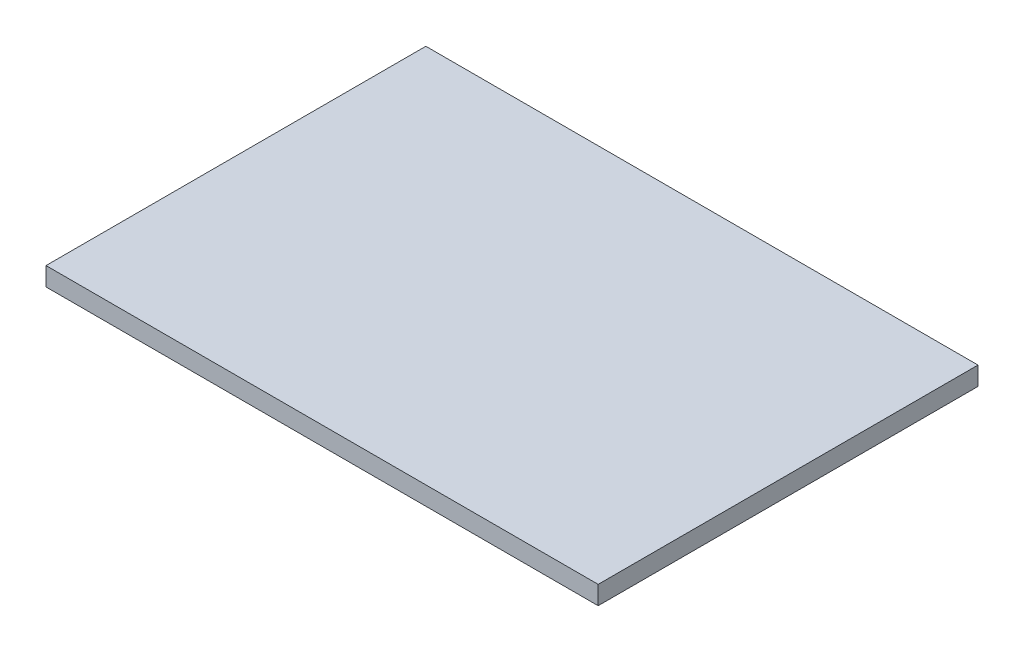
ISO-10303-21;
HEADER;
FILE_DESCRIPTION(('STEP AP214'),'2;1');
FILE_NAME('part.step','',(''),(''),'','','');
FILE_SCHEMA(('AUTOMOTIVE_DESIGN { 1 0 10303 214 1 1 1 1 }'));
ENDSEC;
DATA;
#1=APPLICATION_CONTEXT('core data for automotive mechanical design processes');
#2=APPLICATION_PROTOCOL_DEFINITION('international standard','automotive_design',2000,#1);
#3=PRODUCT_CONTEXT('',#1,'mechanical');
#4=PRODUCT('Part','Part','',(#3));
#5=PRODUCT_RELATED_PRODUCT_CATEGORY('part','',(#4));
#6=PRODUCT_DEFINITION_FORMATION('','',#4);
#7=PRODUCT_DEFINITION_CONTEXT('part definition',#1,'design');
#8=PRODUCT_DEFINITION('design','',#6,#7);
#9=PRODUCT_DEFINITION_SHAPE('','',#8);
#10=(LENGTH_UNIT() NAMED_UNIT(*) SI_UNIT(.MILLI.,.METRE.));
#11=(NAMED_UNIT(*) PLANE_ANGLE_UNIT() SI_UNIT($,.RADIAN.));
#12=(NAMED_UNIT(*) SI_UNIT($,.STERADIAN.) SOLID_ANGLE_UNIT());
#13=UNCERTAINTY_MEASURE_WITH_UNIT(LENGTH_MEASURE(1.E-05),#10,'distance_accuracy_value','');
#14=(GEOMETRIC_REPRESENTATION_CONTEXT(3) GLOBAL_UNCERTAINTY_ASSIGNED_CONTEXT((#13)) GLOBAL_UNIT_ASSIGNED_CONTEXT((#10,
#11,#12)) REPRESENTATION_CONTEXT('',''));
#15=CARTESIAN_POINT('',(0.,0.,0.));
#16=DIRECTION('',(0.,0.,1.));
#17=DIRECTION('',(1.,0.,0.));
#18=AXIS2_PLACEMENT_3D('',#15,#16,#17);
#19=CARTESIAN_POINT('',(298.,20.,-205.));
#20=DIRECTION('',(-1.,0.,0.));
#21=DIRECTION('',(0.,0.,1.));
#22=AXIS2_PLACEMENT_3D('',#19,#20,#21);
#23=PLANE('',#22);
#24=DIRECTION('',(0.,0.,-1.));
#25=VECTOR('',#24,1.);
#26=CARTESIAN_POINT('',(298.,0.,-205.));
#27=LINE('',#26,#25);
#28=CARTESIAN_POINT('',(298.,0.,205.));
#29=VERTEX_POINT('',#28);
#30=CARTESIAN_POINT('',(298.,0.,-205.));
#31=VERTEX_POINT('',#30);
#32=EDGE_CURVE('E98',#29,#31,#27,.T.);
#33=ORIENTED_EDGE('',*,*,#32,.T.);
#34=DIRECTION('',(0.,-1.,0.));
#35=VECTOR('',#34,1.);
#36=CARTESIAN_POINT('',(298.,20.,-205.));
#37=LINE('',#36,#35);
#38=CARTESIAN_POINT('',(298.,20.,-205.));
#39=VERTEX_POINT('',#38);
#40=EDGE_CURVE('E11',#39,#31,#37,.T.);
#41=ORIENTED_EDGE('',*,*,#40,.F.);
#42=DIRECTION('',(0.,0.,-1.));
#43=VECTOR('',#42,1.);
#44=CARTESIAN_POINT('',(298.,20.,-205.));
#45=LINE('',#44,#43);
#46=CARTESIAN_POINT('',(298.,20.,205.));
#47=VERTEX_POINT('',#46);
#48=EDGE_CURVE('E86',#47,#39,#45,.T.);
#49=ORIENTED_EDGE('',*,*,#48,.F.);
#50=DIRECTION('',(0.,-1.,0.));
#51=VECTOR('',#50,1.);
#52=CARTESIAN_POINT('',(298.,20.,205.));
#53=LINE('',#52,#51);
#54=EDGE_CURVE('E94',#47,#29,#53,.T.);
#55=ORIENTED_EDGE('',*,*,#54,.T.);
#56=EDGE_LOOP('',(#33,#41,#49,#55));
#57=FACE_BOUND('',#56,.T.);
#58=ADVANCED_FACE('F35',(#57),#23,.F.);
#59=CARTESIAN_POINT('',(-298.,20.,-205.));
#60=DIRECTION('',(0.,0.,1.));
#61=DIRECTION('',(1.,0.,0.));
#62=AXIS2_PLACEMENT_3D('',#59,#60,#61);
#63=PLANE('',#62);
#64=DIRECTION('',(-1.,0.,0.));
#65=VECTOR('',#64,1.);
#66=CARTESIAN_POINT('',(-298.,0.,-205.));
#67=LINE('',#66,#65);
#68=CARTESIAN_POINT('',(-298.,0.,-205.));
#69=VERTEX_POINT('',#68);
#70=EDGE_CURVE('E90',#31,#69,#67,.T.);
#71=ORIENTED_EDGE('',*,*,#70,.T.);
#72=DIRECTION('',(0.,-1.,0.));
#73=VECTOR('',#72,1.);
#74=CARTESIAN_POINT('',(-298.,20.,-205.));
#75=LINE('',#74,#73);
#76=CARTESIAN_POINT('',(-298.,20.,-205.));
#77=VERTEX_POINT('',#76);
#78=EDGE_CURVE('E43',#77,#69,#75,.T.);
#79=ORIENTED_EDGE('',*,*,#78,.F.);
#80=DIRECTION('',(-1.,0.,0.));
#81=VECTOR('',#80,1.);
#82=CARTESIAN_POINT('',(-298.,20.,-205.));
#83=LINE('',#82,#81);
#84=EDGE_CURVE('E81',#39,#77,#83,.T.);
#85=ORIENTED_EDGE('',*,*,#84,.F.);
#86=ORIENTED_EDGE('',*,*,#40,.T.);
#87=EDGE_LOOP('',(#71,#79,#85,#86));
#88=FACE_BOUND('',#87,.T.);
#89=ADVANCED_FACE('F89',(#88),#63,.F.);
#90=CARTESIAN_POINT('',(-298.,20.,-205.));
#91=DIRECTION('',(1.,0.,0.));
#92=DIRECTION('',(0.,0.,-1.));
#93=AXIS2_PLACEMENT_3D('',#90,#91,#92);
#94=PLANE('',#93);
#95=DIRECTION('',(0.,0.,1.));
#96=VECTOR('',#95,1.);
#97=CARTESIAN_POINT('',(-298.,0.,-205.));
#98=LINE('',#97,#96);
#99=CARTESIAN_POINT('',(-298.,0.,205.));
#100=VERTEX_POINT('',#99);
#101=EDGE_CURVE('E68',#69,#100,#98,.T.);
#102=ORIENTED_EDGE('',*,*,#101,.T.);
#103=DIRECTION('',(0.,-1.,0.));
#104=VECTOR('',#103,1.);
#105=CARTESIAN_POINT('',(-298.,20.,205.));
#106=LINE('',#105,#104);
#107=CARTESIAN_POINT('',(-298.,20.,205.));
#108=VERTEX_POINT('',#107);
#109=EDGE_CURVE('E91',#108,#100,#106,.T.);
#110=ORIENTED_EDGE('',*,*,#109,.F.);
#111=DIRECTION('',(0.,0.,1.));
#112=VECTOR('',#111,1.);
#113=CARTESIAN_POINT('',(-298.,20.,-205.));
#114=LINE('',#113,#112);
#115=EDGE_CURVE('E84',#77,#108,#114,.T.);
#116=ORIENTED_EDGE('',*,*,#115,.F.);
#117=ORIENTED_EDGE('',*,*,#78,.T.);
#118=EDGE_LOOP('',(#102,#110,#116,#117));
#119=FACE_BOUND('',#118,.T.);
#120=ADVANCED_FACE('F92',(#119),#94,.F.);
#121=CARTESIAN_POINT('',(-298.,20.,205.));
#122=DIRECTION('',(0.,0.,-1.));
#123=DIRECTION('',(-1.,0.,0.));
#124=AXIS2_PLACEMENT_3D('',#121,#122,#123);
#125=PLANE('',#124);
#126=DIRECTION('',(1.,0.,0.));
#127=VECTOR('',#126,1.);
#128=CARTESIAN_POINT('',(-298.,0.,205.));
#129=LINE('',#128,#127);
#130=EDGE_CURVE('E74',#100,#29,#129,.T.);
#131=ORIENTED_EDGE('',*,*,#130,.T.);
#132=ORIENTED_EDGE('',*,*,#54,.F.);
#133=DIRECTION('',(1.,0.,0.));
#134=VECTOR('',#133,1.);
#135=CARTESIAN_POINT('',(-298.,20.,205.));
#136=LINE('',#135,#134);
#137=EDGE_CURVE('E51',#108,#47,#136,.T.);
#138=ORIENTED_EDGE('',*,*,#137,.F.);
#139=ORIENTED_EDGE('',*,*,#109,.T.);
#140=EDGE_LOOP('',(#131,#132,#138,#139));
#141=FACE_BOUND('',#140,.T.);
#142=ADVANCED_FACE('F105',(#141),#125,.F.);
#143=CARTESIAN_POINT('',(0.,20.,0.));
#144=DIRECTION('',(0.,1.,0.));
#145=DIRECTION('',(0.,0.,1.));
#146=AXIS2_PLACEMENT_3D('',#143,#144,#145);
#147=PLANE('',#146);
#148=ORIENTED_EDGE('',*,*,#48,.T.);
#149=ORIENTED_EDGE('',*,*,#84,.T.);
#150=ORIENTED_EDGE('',*,*,#115,.T.);
#151=ORIENTED_EDGE('',*,*,#137,.T.);
#152=EDGE_LOOP('',(#148,#149,#150,#151));
#153=FACE_BOUND('',#152,.T.);
#154=ADVANCED_FACE('F82',(#153),#147,.T.);
#155=CARTESIAN_POINT('',(0.,0.,0.));
#156=DIRECTION('',(0.,1.,0.));
#157=DIRECTION('',(0.,0.,1.));
#158=AXIS2_PLACEMENT_3D('',#155,#156,#157);
#159=PLANE('',#158);
#160=ORIENTED_EDGE('',*,*,#32,.F.);
#161=ORIENTED_EDGE('',*,*,#130,.F.);
#162=ORIENTED_EDGE('',*,*,#101,.F.);
#163=ORIENTED_EDGE('',*,*,#70,.F.);
#164=EDGE_LOOP('',(#160,#161,#162,#163));
#165=FACE_BOUND('',#164,.T.);
#166=ADVANCED_FACE('F108',(#165),#159,.F.);
#167=CLOSED_SHELL('',(#58,#89,#120,#142,#154,#166));
#168=MANIFOLD_SOLID_BREP('B2',#167);
#169=ADVANCED_BREP_SHAPE_REPRESENTATION('',(#18,#168),#14);
#170=SHAPE_DEFINITION_REPRESENTATION(#9,#169);
ENDSEC;
END-ISO-10303-21;
